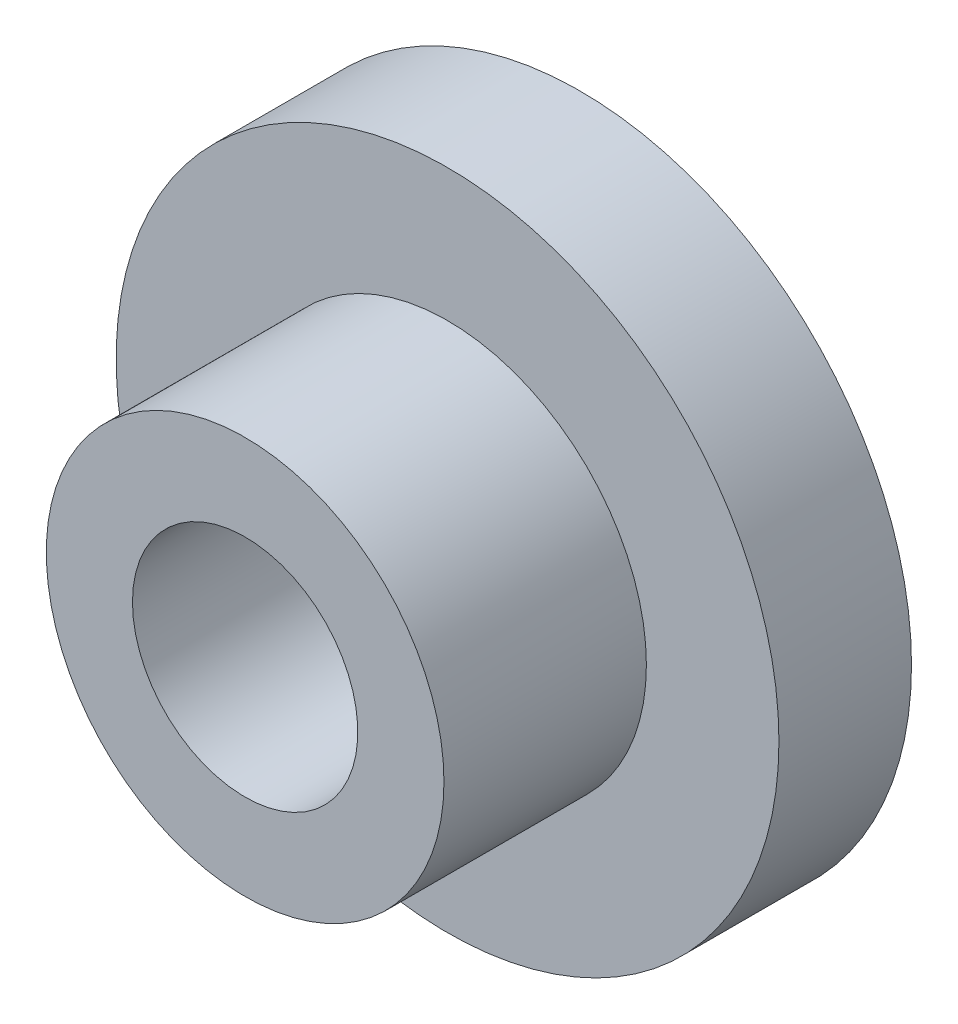
ISO-10303-21;
HEADER;
FILE_DESCRIPTION(('STEP AP214'),'2;1');
FILE_NAME('part.step','',(''),(''),'','','');
FILE_SCHEMA(('AUTOMOTIVE_DESIGN { 1 0 10303 214 1 1 1 1 }'));
ENDSEC;
DATA;
#1=APPLICATION_CONTEXT('core data for automotive mechanical design processes');
#2=APPLICATION_PROTOCOL_DEFINITION('international standard','automotive_design',2000,#1);
#3=PRODUCT_CONTEXT('',#1,'mechanical');
#4=PRODUCT('Part','Part','',(#3));
#5=PRODUCT_RELATED_PRODUCT_CATEGORY('part','',(#4));
#6=PRODUCT_DEFINITION_FORMATION('','',#4);
#7=PRODUCT_DEFINITION_CONTEXT('part definition',#1,'design');
#8=PRODUCT_DEFINITION('design','',#6,#7);
#9=PRODUCT_DEFINITION_SHAPE('','',#8);
#10=(LENGTH_UNIT() NAMED_UNIT(*) SI_UNIT(.MILLI.,.METRE.));
#11=(NAMED_UNIT(*) PLANE_ANGLE_UNIT() SI_UNIT($,.RADIAN.));
#12=(NAMED_UNIT(*) SI_UNIT($,.STERADIAN.) SOLID_ANGLE_UNIT());
#13=UNCERTAINTY_MEASURE_WITH_UNIT(LENGTH_MEASURE(1.E-05),#10,'distance_accuracy_value','');
#14=(GEOMETRIC_REPRESENTATION_CONTEXT(3) GLOBAL_UNCERTAINTY_ASSIGNED_CONTEXT((#13)) GLOBAL_UNIT_ASSIGNED_CONTEXT((#10,
#11,#12)) REPRESENTATION_CONTEXT('',''));
#15=CARTESIAN_POINT('',(0.,0.,0.));
#16=DIRECTION('',(0.,0.,1.));
#17=DIRECTION('',(1.,0.,0.));
#18=AXIS2_PLACEMENT_3D('',#15,#16,#17);
#19=CARTESIAN_POINT('',(-15.5,15.5,1.9460879739461));
#20=DIRECTION('',(0.,0.,1.));
#21=DIRECTION('',(1.,0.,0.));
#22=AXIS2_PLACEMENT_3D('',#19,#20,#21);
#23=PLANE('',#22);
#24=CARTESIAN_POINT('',(-15.5,15.5,1.9460879739461));
#25=DIRECTION('',(0.,0.,1.));
#26=DIRECTION('',(1.,0.,0.));
#27=AXIS2_PLACEMENT_3D('',#24,#25,#26);
#28=CIRCLE('',#27,5.);
#29=CARTESIAN_POINT('',(-10.5,15.5,1.9460879739461));
#30=VERTEX_POINT('',#29);
#31=EDGE_CURVE('E42',#30,#30,#28,.T.);
#32=ORIENTED_EDGE('',*,*,#31,.T.);
#33=EDGE_LOOP('',(#32));
#34=FACE_BOUND('',#33,.T.);
#35=CARTESIAN_POINT('',(-15.5,15.5,1.9460879739461));
#36=DIRECTION('',(0.,0.,1.));
#37=DIRECTION('',(1.,0.,0.));
#38=AXIS2_PLACEMENT_3D('',#35,#36,#37);
#39=CIRCLE('',#38,3.);
#40=CARTESIAN_POINT('',(-12.5,15.5,1.9460879739461));
#41=VERTEX_POINT('',#40);
#42=EDGE_CURVE('E35',#41,#41,#39,.T.);
#43=ORIENTED_EDGE('',*,*,#42,.F.);
#44=EDGE_LOOP('',(#43));
#45=FACE_BOUND('',#44,.T.);
#46=ADVANCED_FACE('F31',(#34,#45),#23,.T.);
#47=CARTESIAN_POINT('',(-15.5,15.5,1.9460879739461));
#48=DIRECTION('',(0.,0.,-1.));
#49=DIRECTION('',(-1.,0.,0.));
#50=AXIS2_PLACEMENT_3D('',#47,#48,#49);
#51=CYLINDRICAL_SURFACE('',#50,5.);
#52=ORIENTED_EDGE('',*,*,#31,.F.);
#53=EDGE_LOOP('',(#52));
#54=FACE_BOUND('',#53,.T.);
#55=CARTESIAN_POINT('',(-15.5,15.5,-0.0539120260539046));
#56=DIRECTION('',(0.,0.,1.));
#57=DIRECTION('',(1.,0.,0.));
#58=AXIS2_PLACEMENT_3D('',#55,#56,#57);
#59=CIRCLE('',#58,5.);
#60=CARTESIAN_POINT('',(-10.5,15.5,-0.0539120260539046));
#61=VERTEX_POINT('',#60);
#62=EDGE_CURVE('E44',#61,#61,#59,.T.);
#63=ORIENTED_EDGE('',*,*,#62,.T.);
#64=EDGE_LOOP('',(#63));
#65=FACE_BOUND('',#64,.T.);
#66=ADVANCED_FACE('F61',(#54,#65),#51,.T.);
#67=CARTESIAN_POINT('',(-15.5,15.5,-0.0539120260539046));
#68=DIRECTION('',(0.,0.,1.));
#69=DIRECTION('',(1.,0.,0.));
#70=AXIS2_PLACEMENT_3D('',#67,#68,#69);
#71=PLANE('',#70);
#72=CARTESIAN_POINT('',(-15.5,15.5,-0.0539120260539053));
#73=DIRECTION('',(0.,0.,-1.));
#74=DIRECTION('',(-1.,0.,0.));
#75=AXIS2_PLACEMENT_3D('',#72,#73,#74);
#76=CIRCLE('',#75,1.69999999999999);
#77=CARTESIAN_POINT('',(-17.2,15.5,-0.0539120260539053));
#78=VERTEX_POINT('',#77);
#79=EDGE_CURVE('E52',#78,#78,#76,.T.);
#80=ORIENTED_EDGE('',*,*,#79,.F.);
#81=EDGE_LOOP('',(#80));
#82=FACE_BOUND('',#81,.T.);
#83=ORIENTED_EDGE('',*,*,#62,.F.);
#84=EDGE_LOOP('',(#83));
#85=FACE_BOUND('',#84,.T.);
#86=ADVANCED_FACE('F58',(#82,#85),#71,.F.);
#87=CARTESIAN_POINT('',(-15.5,15.5,5.));
#88=DIRECTION('',(0.,0.,-1.));
#89=DIRECTION('',(-1.,0.,0.));
#90=AXIS2_PLACEMENT_3D('',#87,#88,#89);
#91=CYLINDRICAL_SURFACE('',#90,3.);
#92=ORIENTED_EDGE('',*,*,#42,.T.);
#93=EDGE_LOOP('',(#92));
#94=FACE_BOUND('',#93,.T.);
#95=CARTESIAN_POINT('',(-15.5,15.5,5.));
#96=DIRECTION('',(0.,0.,1.));
#97=DIRECTION('',(1.,0.,0.));
#98=AXIS2_PLACEMENT_3D('',#95,#96,#97);
#99=CIRCLE('',#98,3.);
#100=CARTESIAN_POINT('',(-12.5,15.5,5.));
#101=VERTEX_POINT('',#100);
#102=EDGE_CURVE('E10',#101,#101,#99,.T.);
#103=ORIENTED_EDGE('',*,*,#102,.F.);
#104=EDGE_LOOP('',(#103));
#105=FACE_BOUND('',#104,.T.);
#106=ADVANCED_FACE('F33',(#94,#105),#91,.T.);
#107=CARTESIAN_POINT('',(-15.5,15.5,5.));
#108=DIRECTION('',(0.,0.,1.));
#109=DIRECTION('',(1.,0.,0.));
#110=AXIS2_PLACEMENT_3D('',#107,#108,#109);
#111=PLANE('',#110);
#112=CARTESIAN_POINT('',(-15.5,15.5,5.));
#113=DIRECTION('',(0.,0.,-1.));
#114=DIRECTION('',(-1.,0.,0.));
#115=AXIS2_PLACEMENT_3D('',#112,#113,#114);
#116=CIRCLE('',#115,1.69999999999999);
#117=CARTESIAN_POINT('',(-17.2,15.5,5.));
#118=VERTEX_POINT('',#117);
#119=EDGE_CURVE('E47',#118,#118,#116,.T.);
#120=ORIENTED_EDGE('',*,*,#119,.T.);
#121=EDGE_LOOP('',(#120));
#122=FACE_BOUND('',#121,.T.);
#123=ORIENTED_EDGE('',*,*,#102,.T.);
#124=EDGE_LOOP('',(#123));
#125=FACE_BOUND('',#124,.T.);
#126=ADVANCED_FACE('F74',(#122,#125),#111,.T.);
#127=CARTESIAN_POINT('',(-15.5,15.5,-0.053912026053904));
#128=DIRECTION('',(0.,0.,-1.));
#129=DIRECTION('',(-1.,0.,0.));
#130=AXIS2_PLACEMENT_3D('',#127,#128,#129);
#131=CYLINDRICAL_SURFACE('',#130,1.69999999999999);
#132=ORIENTED_EDGE('',*,*,#119,.F.);
#133=EDGE_LOOP('',(#132));
#134=FACE_BOUND('',#133,.T.);
#135=ORIENTED_EDGE('',*,*,#79,.T.);
#136=EDGE_LOOP('',(#135));
#137=FACE_BOUND('',#136,.T.);
#138=ADVANCED_FACE('F56',(#134,#137),#131,.F.);
#139=CLOSED_SHELL('',(#46,#66,#86,#106,#126,#138));
#140=MANIFOLD_SOLID_BREP('B2',#139);
#141=ADVANCED_BREP_SHAPE_REPRESENTATION('',(#18,#140),#14);
#142=SHAPE_DEFINITION_REPRESENTATION(#9,#141);
ENDSEC;
END-ISO-10303-21;
